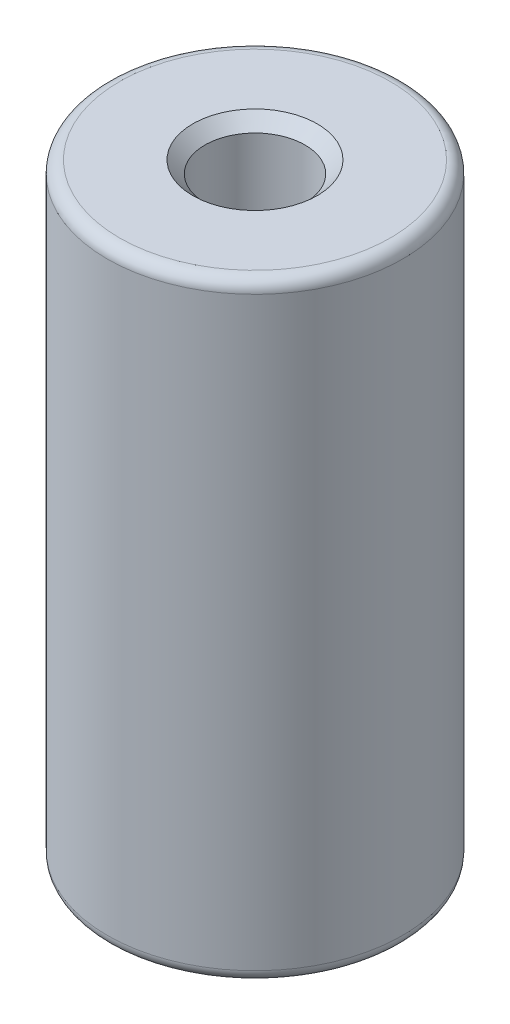
ISO-10303-21;
HEADER;
FILE_DESCRIPTION(('STEP AP214'),'2;1');
FILE_NAME('part.step','',(''),(''),'','','');
FILE_SCHEMA(('AUTOMOTIVE_DESIGN { 1 0 10303 214 1 1 1 1 }'));
ENDSEC;
DATA;
#1=APPLICATION_CONTEXT('core data for automotive mechanical design processes');
#2=APPLICATION_PROTOCOL_DEFINITION('international standard','automotive_design',2000,#1);
#3=PRODUCT_CONTEXT('',#1,'mechanical');
#4=PRODUCT('Part','Part','',(#3));
#5=PRODUCT_RELATED_PRODUCT_CATEGORY('part','',(#4));
#6=PRODUCT_DEFINITION_FORMATION('','',#4);
#7=PRODUCT_DEFINITION_CONTEXT('part definition',#1,'design');
#8=PRODUCT_DEFINITION('design','',#6,#7);
#9=PRODUCT_DEFINITION_SHAPE('','',#8);
#10=(LENGTH_UNIT() NAMED_UNIT(*) SI_UNIT(.MILLI.,.METRE.));
#11=(NAMED_UNIT(*) PLANE_ANGLE_UNIT() SI_UNIT($,.RADIAN.));
#12=(NAMED_UNIT(*) SI_UNIT($,.STERADIAN.) SOLID_ANGLE_UNIT());
#13=UNCERTAINTY_MEASURE_WITH_UNIT(LENGTH_MEASURE(1.E-05),#10,'distance_accuracy_value','');
#14=(GEOMETRIC_REPRESENTATION_CONTEXT(3) GLOBAL_UNCERTAINTY_ASSIGNED_CONTEXT((#13)) GLOBAL_UNIT_ASSIGNED_CONTEXT((#10,
#11,#12)) REPRESENTATION_CONTEXT('',''));
#15=CARTESIAN_POINT('',(0.,0.,0.));
#16=DIRECTION('',(0.,0.,1.));
#17=DIRECTION('',(1.,0.,0.));
#18=AXIS2_PLACEMENT_3D('',#15,#16,#17);
#19=CARTESIAN_POINT('',(0.,25.,0.));
#20=DIRECTION('',(0.,1.,0.));
#21=DIRECTION('',(0.,0.,1.));
#22=AXIS2_PLACEMENT_3D('',#19,#20,#21);
#23=PLANE('',#22);
#24=CARTESIAN_POINT('',(0.,25.,0.));
#25=DIRECTION('',(0.,1.,0.));
#26=DIRECTION('',(0.,0.,1.));
#27=AXIS2_PLACEMENT_3D('',#24,#25,#26);
#28=CIRCLE('',#27,5.55);
#29=CARTESIAN_POINT('',(0.,25.,5.55));
#30=VERTEX_POINT('',#29);
#31=EDGE_CURVE('E10',#30,#30,#28,.T.);
#32=ORIENTED_EDGE('',*,*,#31,.T.);
#33=EDGE_LOOP('',(#32));
#34=FACE_BOUND('',#33,.T.);
#35=CARTESIAN_POINT('',(0.,25.,0.));
#36=DIRECTION('',(0.,1.,0.));
#37=DIRECTION('',(0.,0.,1.));
#38=AXIS2_PLACEMENT_3D('',#35,#36,#37);
#39=CIRCLE('',#38,2.55);
#40=CARTESIAN_POINT('',(0.,25.,2.55));
#41=VERTEX_POINT('',#40);
#42=EDGE_CURVE('E52',#41,#41,#39,.F.);
#43=ORIENTED_EDGE('',*,*,#42,.T.);
#44=EDGE_LOOP('',(#43));
#45=FACE_BOUND('',#44,.T.);
#46=ADVANCED_FACE('F32',(#34,#45),#23,.T.);
#47=CARTESIAN_POINT('',(0.,0.,0.));
#48=DIRECTION('',(0.,1.,0.));
#49=DIRECTION('',(0.,0.,1.));
#50=AXIS2_PLACEMENT_3D('',#47,#48,#49);
#51=PLANE('',#50);
#52=CARTESIAN_POINT('',(0.,0.,0.));
#53=DIRECTION('',(0.,1.,0.));
#54=DIRECTION('',(0.,0.,1.));
#55=AXIS2_PLACEMENT_3D('',#52,#53,#54);
#56=CIRCLE('',#55,5.55);
#57=CARTESIAN_POINT('',(0.,0.,5.55));
#58=VERTEX_POINT('',#57);
#59=EDGE_CURVE('E39',#58,#58,#56,.F.);
#60=ORIENTED_EDGE('',*,*,#59,.T.);
#61=EDGE_LOOP('',(#60));
#62=FACE_BOUND('',#61,.T.);
#63=CARTESIAN_POINT('',(0.,0.,0.));
#64=DIRECTION('',(0.,1.,0.));
#65=DIRECTION('',(0.,0.,1.));
#66=AXIS2_PLACEMENT_3D('',#63,#64,#65);
#67=CIRCLE('',#66,2.55);
#68=CARTESIAN_POINT('',(0.,0.,2.55));
#69=VERTEX_POINT('',#68);
#70=EDGE_CURVE('E61',#69,#69,#67,.T.);
#71=ORIENTED_EDGE('',*,*,#70,.T.);
#72=EDGE_LOOP('',(#71));
#73=FACE_BOUND('',#72,.T.);
#74=ADVANCED_FACE('F65',(#62,#73),#51,.F.);
#75=CARTESIAN_POINT('',(0.,25.,0.));
#76=DIRECTION('',(0.,-1.,0.));
#77=DIRECTION('',(0.,0.,-1.));
#78=AXIS2_PLACEMENT_3D('',#75,#76,#77);
#79=CYLINDRICAL_SURFACE('',#78,6.05);
#80=CARTESIAN_POINT('',(0.,0.5,0.));
#81=DIRECTION('',(0.,1.,0.));
#82=DIRECTION('',(0.,0.,1.));
#83=AXIS2_PLACEMENT_3D('',#80,#81,#82);
#84=CIRCLE('',#83,6.05);
#85=CARTESIAN_POINT('',(0.,0.5,6.05));
#86=VERTEX_POINT('',#85);
#87=EDGE_CURVE('E43',#86,#86,#84,.T.);
#88=ORIENTED_EDGE('',*,*,#87,.T.);
#89=EDGE_LOOP('',(#88));
#90=FACE_BOUND('',#89,.T.);
#91=CARTESIAN_POINT('',(0.,24.5,0.));
#92=DIRECTION('',(0.,1.,0.));
#93=DIRECTION('',(0.,0.,1.));
#94=AXIS2_PLACEMENT_3D('',#91,#92,#93);
#95=CIRCLE('',#94,6.05);
#96=CARTESIAN_POINT('',(0.,24.5,6.05));
#97=VERTEX_POINT('',#96);
#98=EDGE_CURVE('E47',#97,#97,#95,.F.);
#99=ORIENTED_EDGE('',*,*,#98,.T.);
#100=EDGE_LOOP('',(#99));
#101=FACE_BOUND('',#100,.T.);
#102=ADVANCED_FACE('F80',(#90,#101),#79,.T.);
#103=CARTESIAN_POINT('',(0.,25.,0.));
#104=DIRECTION('',(0.,-1.,0.));
#105=DIRECTION('',(0.,0.,-1.));
#106=AXIS2_PLACEMENT_3D('',#103,#104,#105);
#107=CYLINDRICAL_SURFACE('',#106,2.05);
#108=CARTESIAN_POINT('',(0.,0.5,0.));
#109=DIRECTION('',(0.,1.,0.));
#110=DIRECTION('',(0.,0.,1.));
#111=AXIS2_PLACEMENT_3D('',#108,#109,#110);
#112=CIRCLE('',#111,2.05);
#113=CARTESIAN_POINT('',(0.,0.5,2.05));
#114=VERTEX_POINT('',#113);
#115=EDGE_CURVE('E55',#114,#114,#112,.F.);
#116=ORIENTED_EDGE('',*,*,#115,.T.);
#117=EDGE_LOOP('',(#116));
#118=FACE_BOUND('',#117,.T.);
#119=CARTESIAN_POINT('',(0.,24.5,0.));
#120=DIRECTION('',(0.,1.,0.));
#121=DIRECTION('',(0.,0.,1.));
#122=AXIS2_PLACEMENT_3D('',#119,#120,#121);
#123=CIRCLE('',#122,2.05);
#124=CARTESIAN_POINT('',(0.,24.5,2.05));
#125=VERTEX_POINT('',#124);
#126=EDGE_CURVE('E58',#125,#125,#123,.T.);
#127=ORIENTED_EDGE('',*,*,#126,.T.);
#128=EDGE_LOOP('',(#127));
#129=FACE_BOUND('',#128,.T.);
#130=ADVANCED_FACE('F70',(#118,#129),#107,.F.);
#131=CARTESIAN_POINT('',(0.,0.,0.));
#132=DIRECTION('',(0.,-1.,0.));
#133=DIRECTION('',(0.,0.,-1.));
#134=AXIS2_PLACEMENT_3D('',#131,#132,#133);
#135=CONICAL_SURFACE('',#134,2.55,0.785398163397445);
#136=ORIENTED_EDGE('',*,*,#115,.F.);
#137=EDGE_LOOP('',(#136));
#138=FACE_BOUND('',#137,.T.);
#139=ORIENTED_EDGE('',*,*,#70,.F.);
#140=EDGE_LOOP('',(#139));
#141=FACE_BOUND('',#140,.T.);
#142=ADVANCED_FACE('F67',(#138,#141),#135,.F.);
#143=CARTESIAN_POINT('',(0.,24.5,0.));
#144=DIRECTION('',(0.,1.,0.));
#145=DIRECTION('',(0.,0.,1.));
#146=AXIS2_PLACEMENT_3D('',#143,#144,#145);
#147=CONICAL_SURFACE('',#146,2.05,0.785398163397455);
#148=ORIENTED_EDGE('',*,*,#42,.F.);
#149=EDGE_LOOP('',(#148));
#150=FACE_BOUND('',#149,.T.);
#151=ORIENTED_EDGE('',*,*,#126,.F.);
#152=EDGE_LOOP('',(#151));
#153=FACE_BOUND('',#152,.T.);
#154=ADVANCED_FACE('F69',(#150,#153),#147,.F.);
#155=CARTESIAN_POINT('',(0.,0.5,0.));
#156=DIRECTION('',(0.,1.,0.));
#157=DIRECTION('',(0.,0.,1.));
#158=AXIS2_PLACEMENT_3D('',#155,#156,#157);
#159=TOROIDAL_SURFACE('',#158,5.55,0.5);
#160=ORIENTED_EDGE('',*,*,#59,.F.);
#161=EDGE_LOOP('',(#160));
#162=FACE_BOUND('',#161,.T.);
#163=ORIENTED_EDGE('',*,*,#87,.F.);
#164=EDGE_LOOP('',(#163));
#165=FACE_BOUND('',#164,.T.);
#166=ADVANCED_FACE('F77',(#162,#165),#159,.T.);
#167=CARTESIAN_POINT('',(0.,24.5,0.));
#168=DIRECTION('',(0.,1.,0.));
#169=DIRECTION('',(0.,0.,1.));
#170=AXIS2_PLACEMENT_3D('',#167,#168,#169);
#171=TOROIDAL_SURFACE('',#170,5.55,0.5);
#172=ORIENTED_EDGE('',*,*,#98,.F.);
#173=EDGE_LOOP('',(#172));
#174=FACE_BOUND('',#173,.T.);
#175=ORIENTED_EDGE('',*,*,#31,.F.);
#176=EDGE_LOOP('',(#175));
#177=FACE_BOUND('',#176,.T.);
#178=ADVANCED_FACE('F34',(#174,#177),#171,.T.);
#179=CLOSED_SHELL('',(#46,#74,#102,#130,#142,#154,#166,#178));
#180=MANIFOLD_SOLID_BREP('B2',#179);
#181=ADVANCED_BREP_SHAPE_REPRESENTATION('',(#18,#180),#14);
#182=SHAPE_DEFINITION_REPRESENTATION(#9,#181);
ENDSEC;
END-ISO-10303-21;
